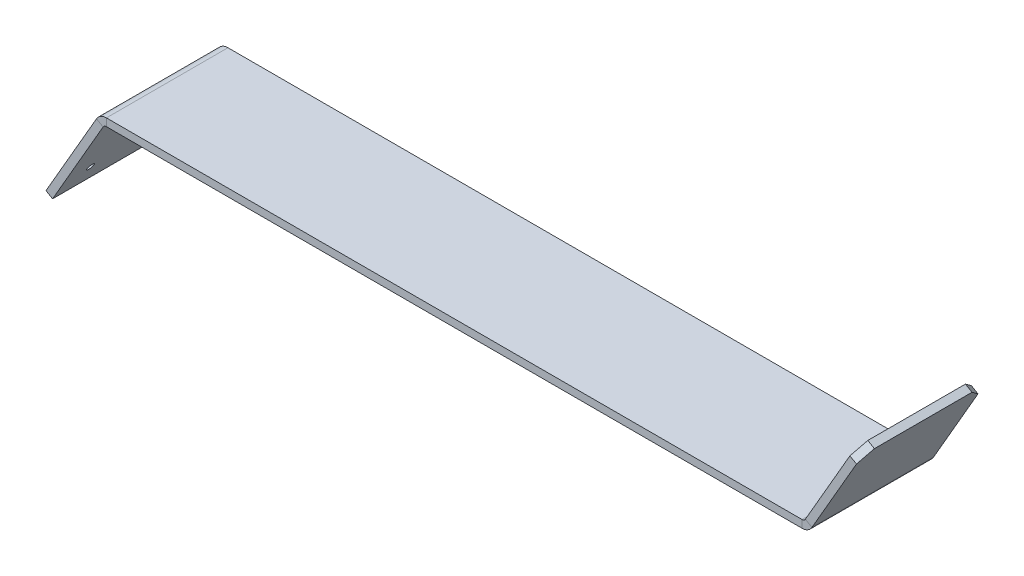
ISO-10303-21;
HEADER;
FILE_DESCRIPTION(('STEP AP214'),'2;1');
FILE_NAME('part.step','',(''),(''),'','','');
FILE_SCHEMA(('AUTOMOTIVE_DESIGN { 1 0 10303 214 1 1 1 1 }'));
ENDSEC;
DATA;
#1=APPLICATION_CONTEXT('core data for automotive mechanical design processes');
#2=APPLICATION_PROTOCOL_DEFINITION('international standard','automotive_design',2000,#1);
#3=PRODUCT_CONTEXT('',#1,'mechanical');
#4=PRODUCT('Part','Part','',(#3));
#5=PRODUCT_RELATED_PRODUCT_CATEGORY('part','',(#4));
#6=PRODUCT_DEFINITION_FORMATION('','',#4);
#7=PRODUCT_DEFINITION_CONTEXT('part definition',#1,'design');
#8=PRODUCT_DEFINITION('design','',#6,#7);
#9=PRODUCT_DEFINITION_SHAPE('','',#8);
#10=(LENGTH_UNIT() NAMED_UNIT(*) SI_UNIT(.MILLI.,.METRE.));
#11=(NAMED_UNIT(*) PLANE_ANGLE_UNIT() SI_UNIT($,.RADIAN.));
#12=(NAMED_UNIT(*) SI_UNIT($,.STERADIAN.) SOLID_ANGLE_UNIT());
#13=UNCERTAINTY_MEASURE_WITH_UNIT(LENGTH_MEASURE(1.E-05),#10,'distance_accuracy_value','');
#14=(GEOMETRIC_REPRESENTATION_CONTEXT(3) GLOBAL_UNCERTAINTY_ASSIGNED_CONTEXT((#13)) GLOBAL_UNIT_ASSIGNED_CONTEXT((#10,
#11,#12)) REPRESENTATION_CONTEXT('',''));
#15=CARTESIAN_POINT('',(0.,0.,0.));
#16=DIRECTION('',(0.,0.,1.));
#17=DIRECTION('',(1.,0.,0.));
#18=AXIS2_PLACEMENT_3D('',#15,#16,#17);
#19=CARTESIAN_POINT('',(-12.9100653599426,-31.9008891324553,-10.8));
#20=DIRECTION('',(-0.866025403784436,0.500000000000004,0.));
#21=DIRECTION('',(-0.500000000000004,-0.866025403784436,0.));
#22=AXIS2_PLACEMENT_3D('',#19,#20,#21);
#23=CYLINDRICAL_SURFACE('',#22,1.5);
#24=CARTESIAN_POINT('',(-12.9100653599426,-31.9008891324553,-10.8));
#25=DIRECTION('',(-0.866025403784436,0.500000000000004,0.));
#26=DIRECTION('',(-0.500000000000004,-0.866025403784436,0.));
#27=AXIS2_PLACEMENT_3D('',#24,#25,#26);
#28=CIRCLE('',#27,1.5);
#29=CARTESIAN_POINT('',(-13.6600653599426,-33.1999272381319,-10.8));
#30=VERTEX_POINT('',#29);
#31=EDGE_CURVE('E90',#30,#30,#28,.T.);
#32=ORIENTED_EDGE('',*,*,#31,.F.);
#33=EDGE_LOOP('',(#32));
#34=FACE_BOUND('',#33,.T.);
#35=CARTESIAN_POINT('',(-15.6640261439771,-30.3108891324553,-10.8));
#36=DIRECTION('',(-0.866025403784436,0.500000000000004,0.));
#37=DIRECTION('',(-0.500000000000004,-0.866025403784436,0.));
#38=AXIS2_PLACEMENT_3D('',#35,#36,#37);
#39=CIRCLE('',#38,1.5);
#40=CARTESIAN_POINT('',(-16.4140261439771,-31.6099272381319,-10.8));
#41=VERTEX_POINT('',#40);
#42=EDGE_CURVE('E13',#41,#41,#39,.T.);
#43=ORIENTED_EDGE('',*,*,#42,.T.);
#44=EDGE_LOOP('',(#43));
#45=FACE_BOUND('',#44,.T.);
#46=ADVANCED_FACE('F83',(#34,#45),#23,.F.);
#47=CARTESIAN_POINT('',(-0.410065359942499,-10.2502540378444,-10.8));
#48=DIRECTION('',(-0.866025403784436,0.500000000000004,0.));
#49=DIRECTION('',(-0.500000000000004,-0.866025403784436,0.));
#50=AXIS2_PLACEMENT_3D('',#47,#48,#49);
#51=CYLINDRICAL_SURFACE('',#50,1.5);
#52=CARTESIAN_POINT('',(-0.410065359942499,-10.2502540378444,-10.8));
#53=DIRECTION('',(-0.866025403784436,0.500000000000004,0.));
#54=DIRECTION('',(-0.500000000000004,-0.866025403784436,0.));
#55=AXIS2_PLACEMENT_3D('',#52,#53,#54);
#56=CIRCLE('',#55,1.5);
#57=CARTESIAN_POINT('',(-1.16006535994251,-11.549292143521,-10.8));
#58=VERTEX_POINT('',#57);
#59=EDGE_CURVE('E324',#58,#58,#56,.T.);
#60=ORIENTED_EDGE('',*,*,#59,.F.);
#61=EDGE_LOOP('',(#60));
#62=FACE_BOUND('',#61,.T.);
#63=CARTESIAN_POINT('',(-3.16402614397701,-8.66025403784436,-10.8));
#64=DIRECTION('',(-0.866025403784436,0.500000000000004,0.));
#65=DIRECTION('',(-0.500000000000004,-0.866025403784436,0.));
#66=AXIS2_PLACEMENT_3D('',#63,#64,#65);
#67=CIRCLE('',#66,1.5);
#68=CARTESIAN_POINT('',(-3.91402614397701,-9.95929214352102,-10.8));
#69=VERTEX_POINT('',#68);
#70=EDGE_CURVE('E327',#69,#69,#67,.T.);
#71=ORIENTED_EDGE('',*,*,#70,.T.);
#72=EDGE_LOOP('',(#71));
#73=FACE_BOUND('',#72,.T.);
#74=ADVANCED_FACE('F336',(#62,#73),#51,.F.);
#75=CARTESIAN_POINT('',(0.,-3.18,-50.8));
#76=DIRECTION('',(0.,0.,1.));
#77=DIRECTION('',(1.,0.,0.));
#78=AXIS2_PLACEMENT_3D('',#75,#76,#77);
#79=PLANE('',#78);
#80=DIRECTION('',(0.,1.,0.));
#81=VECTOR('',#80,1.);
#82=CARTESIAN_POINT('',(4.59570814274943,-3.18,-50.8));
#83=LINE('',#82,#81);
#84=CARTESIAN_POINT('',(4.59570814274943,-3.18,-50.8));
#85=VERTEX_POINT('',#84);
#86=CARTESIAN_POINT('',(4.59570814274943,0.,-50.8));
#87=VERTEX_POINT('',#86);
#88=EDGE_CURVE('E235',#85,#87,#83,.T.);
#89=ORIENTED_EDGE('',*,*,#88,.T.);
#90=DIRECTION('',(1.,0.,0.));
#91=VECTOR('',#90,1.);
#92=CARTESIAN_POINT('',(0.,0.,-50.8));
#93=LINE('',#92,#91);
#94=CARTESIAN_POINT('',(295.404291857251,0.,-50.8));
#95=VERTEX_POINT('',#94);
#96=EDGE_CURVE('E298',#87,#95,#93,.T.);
#97=ORIENTED_EDGE('',*,*,#96,.T.);
#98=DIRECTION('',(0.,-1.,0.));
#99=VECTOR('',#98,1.);
#100=CARTESIAN_POINT('',(295.404291857251,0.,-50.8));
#101=LINE('',#100,#99);
#102=CARTESIAN_POINT('',(295.404291857251,-3.17999999999998,-50.8));
#103=VERTEX_POINT('',#102);
#104=EDGE_CURVE('E284',#95,#103,#101,.T.);
#105=ORIENTED_EDGE('',*,*,#104,.T.);
#106=DIRECTION('',(1.,0.,0.));
#107=VECTOR('',#106,1.);
#108=CARTESIAN_POINT('',(0.,-3.18,-50.8));
#109=LINE('',#108,#107);
#110=EDGE_CURVE('E301',#85,#103,#109,.T.);
#111=ORIENTED_EDGE('',*,*,#110,.F.);
#112=EDGE_LOOP('',(#89,#97,#105,#111));
#113=FACE_BOUND('',#112,.T.);
#114=ADVANCED_FACE('F417',(#113),#79,.F.);
#115=CARTESIAN_POINT('',(0.,-3.18,0.));
#116=DIRECTION('',(0.,1.,0.));
#117=DIRECTION('',(0.,0.,1.));
#118=AXIS2_PLACEMENT_3D('',#115,#116,#117);
#119=PLANE('',#118);
#120=DIRECTION('',(0.,0.,-1.));
#121=VECTOR('',#120,1.);
#122=CARTESIAN_POINT('',(4.59570814274943,-3.18,-50.8));
#123=LINE('',#122,#121);
#124=CARTESIAN_POINT('',(4.59570814274943,-3.18,0.));
#125=VERTEX_POINT('',#124);
#126=EDGE_CURVE('E241',#85,#125,#123,.F.);
#127=ORIENTED_EDGE('',*,*,#126,.F.);
#128=ORIENTED_EDGE('',*,*,#110,.T.);
#129=DIRECTION('',(0.,0.,-1.));
#130=VECTOR('',#129,1.);
#131=CARTESIAN_POINT('',(295.404291857251,-3.17999999999998,-50.8));
#132=LINE('',#131,#130);
#133=CARTESIAN_POINT('',(295.404291857251,-3.18,0.));
#134=VERTEX_POINT('',#133);
#135=EDGE_CURVE('E277',#103,#134,#132,.F.);
#136=ORIENTED_EDGE('',*,*,#135,.T.);
#137=DIRECTION('',(1.,0.,0.));
#138=VECTOR('',#137,1.);
#139=CARTESIAN_POINT('',(0.,-3.18,0.));
#140=LINE('',#139,#138);
#141=EDGE_CURVE('E303',#125,#134,#140,.T.);
#142=ORIENTED_EDGE('',*,*,#141,.F.);
#143=EDGE_LOOP('',(#127,#128,#136,#142));
#144=FACE_BOUND('',#143,.T.);
#145=ADVANCED_FACE('F413',(#144),#119,.F.);
#146=CARTESIAN_POINT('',(0.,0.,0.));
#147=DIRECTION('',(0.,1.,0.));
#148=DIRECTION('',(0.,0.,1.));
#149=AXIS2_PLACEMENT_3D('',#146,#147,#148);
#150=PLANE('',#149);
#151=ORIENTED_EDGE('',*,*,#96,.F.);
#152=DIRECTION('',(0.,0.,-1.));
#153=VECTOR('',#152,1.);
#154=CARTESIAN_POINT('',(4.59570814274943,0.,-50.8));
#155=LINE('',#154,#153);
#156=CARTESIAN_POINT('',(4.59570814274943,0.,0.));
#157=VERTEX_POINT('',#156);
#158=EDGE_CURVE('E228',#87,#157,#155,.F.);
#159=ORIENTED_EDGE('',*,*,#158,.T.);
#160=DIRECTION('',(1.,0.,0.));
#161=VECTOR('',#160,1.);
#162=CARTESIAN_POINT('',(0.,0.,0.));
#163=LINE('',#162,#161);
#164=CARTESIAN_POINT('',(295.404291857251,0.,0.));
#165=VERTEX_POINT('',#164);
#166=EDGE_CURVE('E304',#157,#165,#163,.T.);
#167=ORIENTED_EDGE('',*,*,#166,.T.);
#168=DIRECTION('',(0.,0.,-1.));
#169=VECTOR('',#168,1.);
#170=CARTESIAN_POINT('',(295.404291857251,0.,-50.8));
#171=LINE('',#170,#169);
#172=EDGE_CURVE('E290',#95,#165,#171,.F.);
#173=ORIENTED_EDGE('',*,*,#172,.F.);
#174=EDGE_LOOP('',(#151,#159,#167,#173));
#175=FACE_BOUND('',#174,.T.);
#176=ADVANCED_FACE('F416',(#175),#150,.T.);
#177=CARTESIAN_POINT('',(0.,-3.18,0.));
#178=DIRECTION('',(0.,0.,1.));
#179=DIRECTION('',(1.,0.,0.));
#180=AXIS2_PLACEMENT_3D('',#177,#178,#179);
#181=PLANE('',#180);
#182=DIRECTION('',(0.,1.,0.));
#183=VECTOR('',#182,1.);
#184=CARTESIAN_POINT('',(4.59570814274943,-3.18,0.));
#185=LINE('',#184,#183);
#186=EDGE_CURVE('E246',#125,#157,#185,.T.);
#187=ORIENTED_EDGE('',*,*,#186,.F.);
#188=ORIENTED_EDGE('',*,*,#141,.T.);
#189=DIRECTION('',(0.,-1.,0.));
#190=VECTOR('',#189,1.);
#191=CARTESIAN_POINT('',(295.404291857251,0.,0.));
#192=LINE('',#191,#190);
#193=EDGE_CURVE('E295',#165,#134,#192,.T.);
#194=ORIENTED_EDGE('',*,*,#193,.F.);
#195=ORIENTED_EDGE('',*,*,#166,.F.);
#196=EDGE_LOOP('',(#187,#188,#194,#195));
#197=FACE_BOUND('',#196,.T.);
#198=ADVANCED_FACE('F408',(#197),#181,.T.);
#199=CARTESIAN_POINT('',(295.404291857251,1.60000000000003,0.));
#200=DIRECTION('',(0.,0.,1.));
#201=DIRECTION('',(0.,-1.,0.));
#202=AXIS2_PLACEMENT_3D('',#199,#200,#201);
#203=PLANE('',#202);
#204=DIRECTION('',(-0.866025403784437,0.500000000000004,0.));
#205=VECTOR('',#204,1.);
#206=CARTESIAN_POINT('',(299.54389328734,-0.789999999999968,0.));
#207=LINE('',#206,#205);
#208=CARTESIAN_POINT('',(296.789932503306,0.800000000000016,0.));
#209=VERTEX_POINT('',#208);
#210=CARTESIAN_POINT('',(299.54389328734,-0.789999999999987,0.));
#211=VERTEX_POINT('',#210);
#212=EDGE_CURVE('E249',#209,#211,#207,.F.);
#213=ORIENTED_EDGE('',*,*,#212,.F.);
#214=CARTESIAN_POINT('',(295.404291857251,1.60000000000003,0.));
#215=DIRECTION('',(0.,0.,-1.));
#216=DIRECTION('',(0.,1.,0.));
#217=AXIS2_PLACEMENT_3D('',#214,#215,#216);
#218=CIRCLE('',#217,1.60000000000002);
#219=EDGE_CURVE('E287',#165,#209,#218,.F.);
#220=ORIENTED_EDGE('',*,*,#219,.F.);
#221=ORIENTED_EDGE('',*,*,#193,.T.);
#222=CARTESIAN_POINT('',(295.404291857251,1.60000000000003,0.));
#223=DIRECTION('',(0.,0.,-1.));
#224=DIRECTION('',(0.,1.,0.));
#225=AXIS2_PLACEMENT_3D('',#222,#223,#224);
#226=CIRCLE('',#225,4.78000000000002);
#227=EDGE_CURVE('E280',#134,#211,#226,.F.);
#228=ORIENTED_EDGE('',*,*,#227,.T.);
#229=EDGE_LOOP('',(#213,#220,#221,#228));
#230=FACE_BOUND('',#229,.T.);
#231=ADVANCED_FACE('F405',(#230),#203,.T.);
#232=CARTESIAN_POINT('',(295.404291857251,1.60000000000003,-50.8));
#233=DIRECTION('',(0.,0.,1.));
#234=DIRECTION('',(0.,-1.,0.));
#235=AXIS2_PLACEMENT_3D('',#232,#233,#234);
#236=PLANE('',#235);
#237=CARTESIAN_POINT('',(295.404291857251,1.60000000000003,-50.8));
#238=DIRECTION('',(0.,0.,-1.));
#239=DIRECTION('',(0.,1.,0.));
#240=AXIS2_PLACEMENT_3D('',#237,#238,#239);
#241=CIRCLE('',#240,1.60000000000002);
#242=CARTESIAN_POINT('',(296.789932503306,0.80000000000002,-50.8));
#243=VERTEX_POINT('',#242);
#244=EDGE_CURVE('E254',#243,#95,#241,.T.);
#245=ORIENTED_EDGE('',*,*,#244,.F.);
#246=DIRECTION('',(-0.866025403784437,0.500000000000004,0.));
#247=VECTOR('',#246,1.);
#248=CARTESIAN_POINT('',(296.789932503306,0.800000000000078,-50.8));
#249=LINE('',#248,#247);
#250=CARTESIAN_POINT('',(299.54389328734,-0.790000000000018,-50.8));
#251=VERTEX_POINT('',#250);
#252=EDGE_CURVE('E270',#243,#251,#249,.F.);
#253=ORIENTED_EDGE('',*,*,#252,.T.);
#254=CARTESIAN_POINT('',(295.404291857251,1.60000000000003,-50.8));
#255=DIRECTION('',(0.,0.,-1.));
#256=DIRECTION('',(0.,1.,0.));
#257=AXIS2_PLACEMENT_3D('',#254,#255,#256);
#258=CIRCLE('',#257,4.78000000000002);
#259=EDGE_CURVE('E281',#251,#103,#258,.T.);
#260=ORIENTED_EDGE('',*,*,#259,.T.);
#261=ORIENTED_EDGE('',*,*,#104,.F.);
#262=EDGE_LOOP('',(#245,#253,#260,#261));
#263=FACE_BOUND('',#262,.T.);
#264=ADVANCED_FACE('F400',(#263),#236,.F.);
#265=CARTESIAN_POINT('',(295.404291857251,1.60000000000003,-50.8));
#266=DIRECTION('',(0.,0.,-1.));
#267=DIRECTION('',(0.866025403784436,-0.500000000000004,0.));
#268=AXIS2_PLACEMENT_3D('',#265,#266,#267);
#269=CYLINDRICAL_SURFACE('',#268,4.78000000000002);
#270=ORIENTED_EDGE('',*,*,#135,.F.);
#271=ORIENTED_EDGE('',*,*,#259,.F.);
#272=DIRECTION('',(0.,0.,-1.));
#273=VECTOR('',#272,1.);
#274=CARTESIAN_POINT('',(299.54389328734,-0.790000000000017,0.));
#275=LINE('',#274,#273);
#276=EDGE_CURVE('E267',#251,#211,#275,.F.);
#277=ORIENTED_EDGE('',*,*,#276,.T.);
#278=ORIENTED_EDGE('',*,*,#227,.F.);
#279=EDGE_LOOP('',(#270,#271,#277,#278));
#280=FACE_BOUND('',#279,.T.);
#281=ADVANCED_FACE('F397',(#280),#269,.T.);
#282=CARTESIAN_POINT('',(295.404291857251,1.60000000000003,-50.8));
#283=DIRECTION('',(0.,0.,-1.));
#284=DIRECTION('',(0.866025403784436,-0.500000000000004,0.));
#285=AXIS2_PLACEMENT_3D('',#282,#283,#284);
#286=CYLINDRICAL_SURFACE('',#285,1.60000000000002);
#287=ORIENTED_EDGE('',*,*,#172,.T.);
#288=ORIENTED_EDGE('',*,*,#219,.T.);
#289=DIRECTION('',(0.,0.,-1.));
#290=VECTOR('',#289,1.);
#291=CARTESIAN_POINT('',(296.789932503306,0.800000000000078,0.));
#292=LINE('',#291,#290);
#293=EDGE_CURVE('E273',#209,#243,#292,.T.);
#294=ORIENTED_EDGE('',*,*,#293,.T.);
#295=ORIENTED_EDGE('',*,*,#244,.T.);
#296=EDGE_LOOP('',(#287,#288,#294,#295));
#297=FACE_BOUND('',#296,.T.);
#298=ADVANCED_FACE('F395',(#297),#286,.F.);
#299=CARTESIAN_POINT('',(299.082013071988,-1.58999999999999,0.));
#300=DIRECTION('',(0.,0.,-1.));
#301=DIRECTION('',(-1.,0.,0.));
#302=AXIS2_PLACEMENT_3D('',#299,#300,#301);
#303=PLANE('',#302);
#304=DIRECTION('',(-0.500000000000004,-0.866025403784436,0.));
#305=VECTOR('',#304,1.);
#306=CARTESIAN_POINT('',(224.082013071987,-131.493810567666,0.));
#307=LINE('',#306,#305);
#308=CARTESIAN_POINT('',(318.164026143977,31.4610161513774,0.));
#309=VERTEX_POINT('',#308);
#310=EDGE_CURVE('E258',#309,#211,#307,.T.);
#311=ORIENTED_EDGE('',*,*,#310,.F.);
#312=DIRECTION('',(-0.866025403784436,0.500000000000004,0.));
#313=VECTOR('',#312,1.);
#314=CARTESIAN_POINT('',(318.164026143977,31.4610161513774,0.));
#315=LINE('',#314,#313);
#316=CARTESIAN_POINT('',(315.410065359943,33.0510161513774,0.));
#317=VERTEX_POINT('',#316);
#318=EDGE_CURVE('E317',#309,#317,#315,.T.);
#319=ORIENTED_EDGE('',*,*,#318,.T.);
#320=DIRECTION('',(0.500000000000004,0.866025403784436,0.));
#321=VECTOR('',#320,1.);
#322=CARTESIAN_POINT('',(296.328052287954,0.,0.));
#323=LINE('',#322,#321);
#324=EDGE_CURVE('E265',#317,#209,#323,.F.);
#325=ORIENTED_EDGE('',*,*,#324,.T.);
#326=ORIENTED_EDGE('',*,*,#212,.T.);
#327=EDGE_LOOP('',(#311,#319,#325,#326));
#328=FACE_BOUND('',#327,.T.);
#329=ADVANCED_FACE('F391',(#328),#303,.F.);
#330=CARTESIAN_POINT('',(320.664026143977,35.7911431702997,-50.8));
#331=DIRECTION('',(0.,0.,1.));
#332=DIRECTION('',(0.,-1.,0.));
#333=AXIS2_PLACEMENT_3D('',#330,#331,#332);
#334=PLANE('',#333);
#335=DIRECTION('',(-0.500000000000004,-0.866025403784436,0.));
#336=VECTOR('',#335,1.);
#337=CARTESIAN_POINT('',(317.910065359943,37.3811431702996,-50.8));
#338=LINE('',#337,#336);
#339=CARTESIAN_POINT('',(315.410065359943,33.0510161513774,-50.8));
#340=VERTEX_POINT('',#339);
#341=EDGE_CURVE('E262',#243,#340,#338,.F.);
#342=ORIENTED_EDGE('',*,*,#341,.T.);
#343=DIRECTION('',(0.866025403784436,-0.500000000000004,0.));
#344=VECTOR('',#343,1.);
#345=CARTESIAN_POINT('',(318.164026143977,31.4610161513774,-50.8));
#346=LINE('',#345,#344);
#347=CARTESIAN_POINT('',(318.164026143977,31.4610161513774,-50.8));
#348=VERTEX_POINT('',#347);
#349=EDGE_CURVE('E313',#340,#348,#346,.T.);
#350=ORIENTED_EDGE('',*,*,#349,.T.);
#351=DIRECTION('',(0.500000000000004,0.866025403784436,0.));
#352=VECTOR('',#351,1.);
#353=CARTESIAN_POINT('',(224.082013071987,-131.493810567666,-50.8));
#354=LINE('',#353,#352);
#355=EDGE_CURVE('E255',#251,#348,#354,.T.);
#356=ORIENTED_EDGE('',*,*,#355,.F.);
#357=ORIENTED_EDGE('',*,*,#252,.F.);
#358=EDGE_LOOP('',(#342,#350,#356,#357));
#359=FACE_BOUND('',#358,.T.);
#360=ADVANCED_FACE('F383',(#359),#334,.F.);
#361=CARTESIAN_POINT('',(224.082013071987,-131.493810567666,0.));
#362=DIRECTION('',(-0.866025403784437,0.500000000000004,0.));
#363=DIRECTION('',(-0.500000000000004,-0.866025403784436,0.));
#364=AXIS2_PLACEMENT_3D('',#361,#362,#363);
#365=PLANE('',#364);
#366=DIRECTION('',(0.,0.,1.));
#367=VECTOR('',#366,1.);
#368=CARTESIAN_POINT('',(320.664026143977,35.7911431702996,0.));
#369=LINE('',#368,#367);
#370=CARTESIAN_POINT('',(320.664026143977,35.7911431702996,-45.8));
#371=VERTEX_POINT('',#370);
#372=CARTESIAN_POINT('',(320.664026143977,35.7911431702996,-5.00000000000004));
#373=VERTEX_POINT('',#372);
#374=EDGE_CURVE('E252',#371,#373,#369,.T.);
#375=ORIENTED_EDGE('',*,*,#374,.T.);
#376=DIRECTION('',(0.353553390593276,0.612372435695793,-0.707106781186548));
#377=VECTOR('',#376,1.);
#378=CARTESIAN_POINT('',(318.164026143977,31.4610161513774,0.));
#379=LINE('',#378,#377);
#380=EDGE_CURVE('E322',#373,#309,#379,.F.);
#381=ORIENTED_EDGE('',*,*,#380,.T.);
#382=ORIENTED_EDGE('',*,*,#310,.T.);
#383=ORIENTED_EDGE('',*,*,#276,.F.);
#384=ORIENTED_EDGE('',*,*,#355,.T.);
#385=DIRECTION('',(-0.353553390593277,-0.612372435695795,-0.707106781186546));
#386=VECTOR('',#385,1.);
#387=CARTESIAN_POINT('',(320.664026143977,35.7911431702997,-45.8));
#388=LINE('',#387,#386);
#389=EDGE_CURVE('E315',#348,#371,#388,.F.);
#390=ORIENTED_EDGE('',*,*,#389,.T.);
#391=EDGE_LOOP('',(#375,#381,#382,#383,#384,#390));
#392=FACE_BOUND('',#391,.T.);
#393=ADVANCED_FACE('F379',(#392),#365,.F.);
#394=CARTESIAN_POINT('',(221.328052287953,-129.903810567666,0.));
#395=DIRECTION('',(-0.866025403784437,0.500000000000004,0.));
#396=DIRECTION('',(-0.500000000000004,-0.866025403784436,0.));
#397=AXIS2_PLACEMENT_3D('',#394,#395,#396);
#398=PLANE('',#397);
#399=ORIENTED_EDGE('',*,*,#324,.F.);
#400=DIRECTION('',(-0.353553390593276,-0.612372435695793,0.707106781186548));
#401=VECTOR('',#400,1.);
#402=CARTESIAN_POINT('',(268.369058823948,-48.4263972081444,94.082013071989));
#403=LINE('',#402,#401);
#404=CARTESIAN_POINT('',(317.910065359943,37.3811431702996,-5.00000000000004));
#405=VERTEX_POINT('',#404);
#406=EDGE_CURVE('E105',#317,#405,#403,.F.);
#407=ORIENTED_EDGE('',*,*,#406,.T.);
#408=DIRECTION('',(0.,0.,-1.));
#409=VECTOR('',#408,1.);
#410=CARTESIAN_POINT('',(317.910065359943,37.3811431702996,0.));
#411=LINE('',#410,#409);
#412=CARTESIAN_POINT('',(317.910065359943,37.3811431702996,-45.8));
#413=VERTEX_POINT('',#412);
#414=EDGE_CURVE('E260',#413,#405,#411,.F.);
#415=ORIENTED_EDGE('',*,*,#414,.F.);
#416=DIRECTION('',(0.353553390593277,0.612372435695795,0.707106781186546));
#417=VECTOR('',#416,1.);
#418=CARTESIAN_POINT('',(281.069058823948,-26.4293519520202,-119.482013071989));
#419=LINE('',#418,#417);
#420=EDGE_CURVE('E311',#413,#340,#419,.F.);
#421=ORIENTED_EDGE('',*,*,#420,.T.);
#422=ORIENTED_EDGE('',*,*,#341,.F.);
#423=ORIENTED_EDGE('',*,*,#293,.F.);
#424=EDGE_LOOP('',(#399,#407,#415,#421,#422,#423));
#425=FACE_BOUND('',#424,.T.);
#426=ADVANCED_FACE('F382',(#425),#398,.T.);
#427=CARTESIAN_POINT('',(320.664026143977,35.7911431702997,0.));
#428=DIRECTION('',(-0.500000000000004,-0.866025403784436,0.));
#429=DIRECTION('',(0.866025403784436,-0.500000000000004,0.));
#430=AXIS2_PLACEMENT_3D('',#427,#428,#429);
#431=PLANE('',#430);
#432=ORIENTED_EDGE('',*,*,#414,.T.);
#433=DIRECTION('',(0.866025403784436,-0.500000000000004,0.));
#434=VECTOR('',#433,1.);
#435=CARTESIAN_POINT('',(320.664026143977,35.7911431702997,-5.00000000000004));
#436=LINE('',#435,#434);
#437=EDGE_CURVE('E97',#405,#373,#436,.T.);
#438=ORIENTED_EDGE('',*,*,#437,.T.);
#439=ORIENTED_EDGE('',*,*,#374,.F.);
#440=DIRECTION('',(-0.866025403784436,0.500000000000004,0.));
#441=VECTOR('',#440,1.);
#442=CARTESIAN_POINT('',(320.664026143977,35.7911431702997,-45.8));
#443=LINE('',#442,#441);
#444=EDGE_CURVE('E306',#371,#413,#443,.T.);
#445=ORIENTED_EDGE('',*,*,#444,.T.);
#446=EDGE_LOOP('',(#432,#438,#439,#445));
#447=FACE_BOUND('',#446,.T.);
#448=ADVANCED_FACE('F374',(#447),#431,.F.);
#449=CARTESIAN_POINT('',(4.59570814274943,-4.78,0.));
#450=DIRECTION('',(0.,0.,1.));
#451=DIRECTION('',(1.,0.,0.));
#452=AXIS2_PLACEMENT_3D('',#449,#450,#451);
#453=PLANE('',#452);
#454=DIRECTION('',(0.866025403784436,-0.500000000000004,0.));
#455=VECTOR('',#454,1.);
#456=CARTESIAN_POINT('',(0.45610671265982,-2.38999999999998,0.));
#457=LINE('',#456,#455);
#458=CARTESIAN_POINT('',(3.21006749669433,-3.97999999999999,0.));
#459=VERTEX_POINT('',#458);
#460=CARTESIAN_POINT('',(0.456106712659822,-2.38999999999998,0.));
#461=VERTEX_POINT('',#460);
#462=EDGE_CURVE('E210',#459,#461,#457,.F.);
#463=ORIENTED_EDGE('',*,*,#462,.F.);
#464=CARTESIAN_POINT('',(4.59570814274943,-4.78,0.));
#465=DIRECTION('',(0.,0.,-1.));
#466=DIRECTION('',(-1.,0.,0.));
#467=AXIS2_PLACEMENT_3D('',#464,#465,#466);
#468=CIRCLE('',#467,1.6);
#469=EDGE_CURVE('E238',#125,#459,#468,.F.);
#470=ORIENTED_EDGE('',*,*,#469,.F.);
#471=ORIENTED_EDGE('',*,*,#186,.T.);
#472=CARTESIAN_POINT('',(4.59570814274943,-4.78,0.));
#473=DIRECTION('',(0.,0.,-1.));
#474=DIRECTION('',(-1.,0.,0.));
#475=AXIS2_PLACEMENT_3D('',#472,#473,#474);
#476=CIRCLE('',#475,4.78);
#477=EDGE_CURVE('E231',#157,#461,#476,.F.);
#478=ORIENTED_EDGE('',*,*,#477,.T.);
#479=EDGE_LOOP('',(#463,#470,#471,#478));
#480=FACE_BOUND('',#479,.T.);
#481=ADVANCED_FACE('F371',(#480),#453,.T.);
#482=CARTESIAN_POINT('',(4.59570814274943,-4.78,-50.8));
#483=DIRECTION('',(0.,0.,1.));
#484=DIRECTION('',(1.,0.,0.));
#485=AXIS2_PLACEMENT_3D('',#482,#483,#484);
#486=PLANE('',#485);
#487=CARTESIAN_POINT('',(4.59570814274943,-4.78,-50.8));
#488=DIRECTION('',(0.,0.,-1.));
#489=DIRECTION('',(-1.,0.,0.));
#490=AXIS2_PLACEMENT_3D('',#487,#488,#489);
#491=CIRCLE('',#490,1.6);
#492=CARTESIAN_POINT('',(3.21006749669433,-3.97999999999999,-50.8));
#493=VERTEX_POINT('',#492);
#494=EDGE_CURVE('E243',#493,#85,#491,.T.);
#495=ORIENTED_EDGE('',*,*,#494,.F.);
#496=DIRECTION('',(0.866025403784436,-0.500000000000004,0.));
#497=VECTOR('',#496,1.);
#498=CARTESIAN_POINT('',(3.21006749669433,-3.97999999999999,-50.8));
#499=LINE('',#498,#497);
#500=CARTESIAN_POINT('',(0.456106712659823,-2.38999999999998,-50.8));
#501=VERTEX_POINT('',#500);
#502=EDGE_CURVE('E221',#493,#501,#499,.F.);
#503=ORIENTED_EDGE('',*,*,#502,.T.);
#504=CARTESIAN_POINT('',(4.59570814274943,-4.78,-50.8));
#505=DIRECTION('',(0.,0.,-1.));
#506=DIRECTION('',(-1.,0.,0.));
#507=AXIS2_PLACEMENT_3D('',#504,#505,#506);
#508=CIRCLE('',#507,4.78);
#509=EDGE_CURVE('E232',#501,#87,#508,.T.);
#510=ORIENTED_EDGE('',*,*,#509,.T.);
#511=ORIENTED_EDGE('',*,*,#88,.F.);
#512=EDGE_LOOP('',(#495,#503,#510,#511));
#513=FACE_BOUND('',#512,.T.);
#514=ADVANCED_FACE('F366',(#513),#486,.F.);
#515=CARTESIAN_POINT('',(4.59570814274943,-4.78,-50.8));
#516=DIRECTION('',(0.,0.,-1.));
#517=DIRECTION('',(-0.866025403784436,0.500000000000004,0.));
#518=AXIS2_PLACEMENT_3D('',#515,#516,#517);
#519=CYLINDRICAL_SURFACE('',#518,4.78);
#520=ORIENTED_EDGE('',*,*,#158,.F.);
#521=ORIENTED_EDGE('',*,*,#509,.F.);
#522=DIRECTION('',(0.,0.,-1.));
#523=VECTOR('',#522,1.);
#524=CARTESIAN_POINT('',(0.456106712659823,-2.38999999999998,0.));
#525=LINE('',#524,#523);
#526=EDGE_CURVE('E219',#501,#461,#525,.F.);
#527=ORIENTED_EDGE('',*,*,#526,.T.);
#528=ORIENTED_EDGE('',*,*,#477,.F.);
#529=EDGE_LOOP('',(#520,#521,#527,#528));
#530=FACE_BOUND('',#529,.T.);
#531=ADVANCED_FACE('F363',(#530),#519,.T.);
#532=CARTESIAN_POINT('',(4.59570814274943,-4.78,-50.8));
#533=DIRECTION('',(0.,0.,-1.));
#534=DIRECTION('',(-0.866025403784436,0.500000000000004,0.));
#535=AXIS2_PLACEMENT_3D('',#532,#533,#534);
#536=CYLINDRICAL_SURFACE('',#535,1.6);
#537=ORIENTED_EDGE('',*,*,#126,.T.);
#538=ORIENTED_EDGE('',*,*,#469,.T.);
#539=DIRECTION('',(0.,0.,-1.));
#540=VECTOR('',#539,1.);
#541=CARTESIAN_POINT('',(3.21006749669433,-3.97999999999999,0.));
#542=LINE('',#541,#540);
#543=EDGE_CURVE('E224',#459,#493,#542,.T.);
#544=ORIENTED_EDGE('',*,*,#543,.T.);
#545=ORIENTED_EDGE('',*,*,#494,.T.);
#546=EDGE_LOOP('',(#537,#538,#544,#545));
#547=FACE_BOUND('',#546,.T.);
#548=ADVANCED_FACE('F362',(#547),#536,.F.);
#549=CARTESIAN_POINT('',(0.917986928011522,-1.58999999999999,0.));
#550=DIRECTION('',(0.,0.,-1.));
#551=DIRECTION('',(-1.,0.,0.));
#552=AXIS2_PLACEMENT_3D('',#549,#550,#551);
#553=PLANE('',#552);
#554=ORIENTED_EDGE('',*,*,#462,.T.);
#555=DIRECTION('',(0.500000000000004,0.866025403784436,0.));
#556=VECTOR('',#555,1.);
#557=CARTESIAN_POINT('',(2.29496732002879,0.794999999999999,0.));
#558=LINE('',#557,#556);
#559=CARTESIAN_POINT('',(-20.6640261439771,-38.9711431702996,0.));
#560=VERTEX_POINT('',#559);
#561=EDGE_CURVE('E191',#560,#461,#558,.T.);
#562=ORIENTED_EDGE('',*,*,#561,.F.);
#563=DIRECTION('',(0.866025403784436,-0.500000000000004,0.));
#564=VECTOR('',#563,1.);
#565=CARTESIAN_POINT('',(-20.6640261439771,-38.9711431702996,0.));
#566=LINE('',#565,#564);
#567=CARTESIAN_POINT('',(-17.9100653599426,-40.5611431702996,0.));
#568=VERTEX_POINT('',#567);
#569=EDGE_CURVE('E197',#560,#568,#566,.T.);
#570=ORIENTED_EDGE('',*,*,#569,.T.);
#571=DIRECTION('',(-0.500000000000004,-0.866025403784436,0.));
#572=VECTOR('',#571,1.);
#573=CARTESIAN_POINT('',(3.67194771204603,-3.18,0.));
#574=LINE('',#573,#572);
#575=EDGE_CURVE('E217',#568,#459,#574,.F.);
#576=ORIENTED_EDGE('',*,*,#575,.T.);
#577=EDGE_LOOP('',(#554,#562,#570,#576));
#578=FACE_BOUND('',#577,.T.);
#579=ADVANCED_FACE('F209',(#578),#553,.F.);
#580=CARTESIAN_POINT('',(-20.6640261439771,-38.9711431702996,-50.8));
#581=DIRECTION('',(0.,0.,1.));
#582=DIRECTION('',(0.,-1.,0.));
#583=AXIS2_PLACEMENT_3D('',#580,#581,#582);
#584=PLANE('',#583);
#585=ORIENTED_EDGE('',*,*,#502,.F.);
#586=DIRECTION('',(0.500000000000004,0.866025403784436,0.));
#587=VECTOR('',#586,1.);
#588=CARTESIAN_POINT('',(-17.9100653599426,-40.5611431702996,-50.8));
#589=LINE('',#588,#587);
#590=CARTESIAN_POINT('',(-17.9100653599426,-40.5611431702996,-50.8));
#591=VERTEX_POINT('',#590);
#592=EDGE_CURVE('E213',#493,#591,#589,.F.);
#593=ORIENTED_EDGE('',*,*,#592,.T.);
#594=DIRECTION('',(0.866025403784436,-0.500000000000004,0.));
#595=VECTOR('',#594,1.);
#596=CARTESIAN_POINT('',(-20.6640261439771,-38.9711431702996,-50.8));
#597=LINE('',#596,#595);
#598=CARTESIAN_POINT('',(-20.6640261439771,-38.9711431702996,-50.8));
#599=VERTEX_POINT('',#598);
#600=EDGE_CURVE('E206',#599,#591,#597,.T.);
#601=ORIENTED_EDGE('',*,*,#600,.F.);
#602=DIRECTION('',(-0.500000000000004,-0.866025403784436,0.));
#603=VECTOR('',#602,1.);
#604=CARTESIAN_POINT('',(2.29496732002879,0.794999999999992,-50.8));
#605=LINE('',#604,#603);
#606=EDGE_CURVE('E193',#501,#599,#605,.T.);
#607=ORIENTED_EDGE('',*,*,#606,.F.);
#608=EDGE_LOOP('',(#585,#593,#601,#607));
#609=FACE_BOUND('',#608,.T.);
#610=ADVANCED_FACE('F340',(#609),#584,.F.);
#611=CARTESIAN_POINT('',(2.29496732002879,0.794999999999999,0.));
#612=DIRECTION('',(0.866025403784436,-0.500000000000004,0.));
#613=DIRECTION('',(0.500000000000004,0.866025403784436,0.));
#614=AXIS2_PLACEMENT_3D('',#611,#612,#613);
#615=PLANE('',#614);
#616=CARTESIAN_POINT('',(-15.6640261439771,-30.3108891324553,-40.8));
#617=DIRECTION('',(-0.866025403784436,0.500000000000004,0.));
#618=DIRECTION('',(-0.500000000000004,-0.866025403784436,0.));
#619=AXIS2_PLACEMENT_3D('',#616,#617,#618);
#620=CIRCLE('',#619,1.5);
#621=CARTESIAN_POINT('',(-16.4140261439771,-31.6099272381319,-40.8));
#622=VERTEX_POINT('',#621);
#623=EDGE_CURVE('E697',#622,#622,#620,.T.);
#624=ORIENTED_EDGE('',*,*,#623,.F.);
#625=EDGE_LOOP('',(#624));
#626=FACE_BOUND('',#625,.T.);
#627=CARTESIAN_POINT('',(-3.16402614397701,-8.66025403784436,-40.8));
#628=DIRECTION('',(-0.866025403784436,0.500000000000004,0.));
#629=DIRECTION('',(-0.500000000000004,-0.866025403784436,0.));
#630=AXIS2_PLACEMENT_3D('',#627,#628,#629);
#631=CIRCLE('',#630,1.5);
#632=CARTESIAN_POINT('',(-3.91402614397701,-9.95929214352102,-40.8));
#633=VERTEX_POINT('',#632);
#634=EDGE_CURVE('E698',#633,#633,#631,.T.);
#635=ORIENTED_EDGE('',*,*,#634,.F.);
#636=EDGE_LOOP('',(#635));
#637=FACE_BOUND('',#636,.T.);
#638=ORIENTED_EDGE('',*,*,#526,.F.);
#639=ORIENTED_EDGE('',*,*,#606,.T.);
#640=DIRECTION('',(0.,0.,1.));
#641=VECTOR('',#640,1.);
#642=CARTESIAN_POINT('',(-20.6640261439771,-38.9711431702996,0.));
#643=LINE('',#642,#641);
#644=EDGE_CURVE('E185',#599,#560,#643,.T.);
#645=ORIENTED_EDGE('',*,*,#644,.T.);
#646=ORIENTED_EDGE('',*,*,#561,.T.);
#647=EDGE_LOOP('',(#638,#639,#645,#646));
#648=FACE_BOUND('',#647,.T.);
#649=ORIENTED_EDGE('',*,*,#70,.F.);
#650=EDGE_LOOP('',(#649));
#651=FACE_BOUND('',#650,.T.);
#652=ORIENTED_EDGE('',*,*,#42,.F.);
#653=EDGE_LOOP('',(#652));
#654=FACE_BOUND('',#653,.T.);
#655=ADVANCED_FACE('F188',(#626,#637,#648,#651,#654),#615,.F.);
#656=CARTESIAN_POINT('',(5.0489281040633,-0.795000000000014,0.));
#657=DIRECTION('',(0.866025403784436,-0.500000000000004,0.));
#658=DIRECTION('',(0.500000000000004,0.866025403784436,0.));
#659=AXIS2_PLACEMENT_3D('',#656,#657,#658);
#660=PLANE('',#659);
#661=CARTESIAN_POINT('',(-12.9100653599426,-31.9008891324553,-40.8));
#662=DIRECTION('',(-0.866025403784436,0.500000000000004,0.));
#663=DIRECTION('',(-0.500000000000004,-0.866025403784436,0.));
#664=AXIS2_PLACEMENT_3D('',#661,#662,#663);
#665=CIRCLE('',#664,1.5);
#666=CARTESIAN_POINT('',(-13.6600653599426,-33.1999272381319,-40.8));
#667=VERTEX_POINT('',#666);
#668=EDGE_CURVE('E695',#667,#667,#665,.T.);
#669=ORIENTED_EDGE('',*,*,#668,.T.);
#670=EDGE_LOOP('',(#669));
#671=FACE_BOUND('',#670,.T.);
#672=CARTESIAN_POINT('',(-0.410065359942498,-10.2502540378444,-40.8));
#673=DIRECTION('',(-0.866025403784436,0.500000000000004,0.));
#674=DIRECTION('',(-0.500000000000004,-0.866025403784436,0.));
#675=AXIS2_PLACEMENT_3D('',#672,#673,#674);
#676=CIRCLE('',#675,1.5);
#677=CARTESIAN_POINT('',(-1.16006535994251,-11.549292143521,-40.8));
#678=VERTEX_POINT('',#677);
#679=EDGE_CURVE('E227',#678,#678,#676,.T.);
#680=ORIENTED_EDGE('',*,*,#679,.T.);
#681=EDGE_LOOP('',(#680));
#682=FACE_BOUND('',#681,.T.);
#683=ORIENTED_EDGE('',*,*,#592,.F.);
#684=ORIENTED_EDGE('',*,*,#543,.F.);
#685=ORIENTED_EDGE('',*,*,#575,.F.);
#686=DIRECTION('',(0.,0.,-1.));
#687=VECTOR('',#686,1.);
#688=CARTESIAN_POINT('',(-17.9100653599426,-40.5611431702996,0.));
#689=LINE('',#688,#687);
#690=EDGE_CURVE('E202',#591,#568,#689,.F.);
#691=ORIENTED_EDGE('',*,*,#690,.F.);
#692=EDGE_LOOP('',(#683,#684,#685,#691));
#693=FACE_BOUND('',#692,.T.);
#694=ORIENTED_EDGE('',*,*,#59,.T.);
#695=EDGE_LOOP('',(#694));
#696=FACE_BOUND('',#695,.T.);
#697=ORIENTED_EDGE('',*,*,#31,.T.);
#698=EDGE_LOOP('',(#697));
#699=FACE_BOUND('',#698,.T.);
#700=ADVANCED_FACE('F332',(#671,#682,#693,#696,#699),#660,.T.);
#701=CARTESIAN_POINT('',(-20.6640261439771,-38.9711431702996,0.));
#702=DIRECTION('',(0.500000000000004,0.866025403784436,0.));
#703=DIRECTION('',(-0.866025403784436,0.500000000000004,0.));
#704=AXIS2_PLACEMENT_3D('',#701,#702,#703);
#705=PLANE('',#704);
#706=ORIENTED_EDGE('',*,*,#690,.T.);
#707=ORIENTED_EDGE('',*,*,#569,.F.);
#708=ORIENTED_EDGE('',*,*,#644,.F.);
#709=ORIENTED_EDGE('',*,*,#600,.T.);
#710=EDGE_LOOP('',(#706,#707,#708,#709));
#711=FACE_BOUND('',#710,.T.);
#712=ADVANCED_FACE('F200',(#711),#705,.F.);
#713=CARTESIAN_POINT('',(320.664026143977,35.7911431702997,-45.8));
#714=DIRECTION('',(-0.353553390593276,-0.612372435695791,0.707106781186549));
#715=DIRECTION('',(-0.866025403784436,0.500000000000004,0.));
#716=AXIS2_PLACEMENT_3D('',#713,#714,#715);
#717=PLANE('',#716);
#718=ORIENTED_EDGE('',*,*,#389,.F.);
#719=ORIENTED_EDGE('',*,*,#349,.F.);
#720=ORIENTED_EDGE('',*,*,#420,.F.);
#721=ORIENTED_EDGE('',*,*,#444,.F.);
#722=EDGE_LOOP('',(#718,#719,#720,#721));
#723=FACE_BOUND('',#722,.T.);
#724=ADVANCED_FACE('F358',(#723),#717,.F.);
#725=CARTESIAN_POINT('',(318.164026143977,31.4610161513774,0.));
#726=DIRECTION('',(-0.353553390593277,-0.612372435695793,-0.707106781186547));
#727=DIRECTION('',(-0.866025403784436,0.500000000000004,0.));
#728=AXIS2_PLACEMENT_3D('',#725,#726,#727);
#729=PLANE('',#728);
#730=ORIENTED_EDGE('',*,*,#380,.F.);
#731=ORIENTED_EDGE('',*,*,#437,.F.);
#732=ORIENTED_EDGE('',*,*,#406,.F.);
#733=ORIENTED_EDGE('',*,*,#318,.F.);
#734=EDGE_LOOP('',(#730,#731,#732,#733));
#735=FACE_BOUND('',#734,.T.);
#736=ADVANCED_FACE('F434',(#735),#729,.F.);
#737=CARTESIAN_POINT('',(-0.410065359942498,-10.2502540378444,-40.8));
#738=DIRECTION('',(-0.866025403784436,0.500000000000004,0.));
#739=DIRECTION('',(-0.500000000000004,-0.866025403784436,0.));
#740=AXIS2_PLACEMENT_3D('',#737,#738,#739);
#741=CYLINDRICAL_SURFACE('',#740,1.5);
#742=ORIENTED_EDGE('',*,*,#679,.F.);
#743=EDGE_LOOP('',(#742));
#744=FACE_BOUND('',#743,.T.);
#745=ORIENTED_EDGE('',*,*,#634,.T.);
#746=EDGE_LOOP('',(#745));
#747=FACE_BOUND('',#746,.T.);
#748=ADVANCED_FACE('F354',(#744,#747),#741,.F.);
#749=CARTESIAN_POINT('',(-12.9100653599426,-31.9008891324553,-40.8));
#750=DIRECTION('',(-0.866025403784436,0.500000000000004,0.));
#751=DIRECTION('',(-0.500000000000004,-0.866025403784436,0.));
#752=AXIS2_PLACEMENT_3D('',#749,#750,#751);
#753=CYLINDRICAL_SURFACE('',#752,1.5);
#754=ORIENTED_EDGE('',*,*,#668,.F.);
#755=EDGE_LOOP('',(#754));
#756=FACE_BOUND('',#755,.T.);
#757=ORIENTED_EDGE('',*,*,#623,.T.);
#758=EDGE_LOOP('',(#757));
#759=FACE_BOUND('',#758,.T.);
#760=ADVANCED_FACE('F555',(#756,#759),#753,.F.);
#761=CLOSED_SHELL('',(#46,#74,#114,#145,#176,#198,#231,#264,#281,#298,#329,#360,#393,#426,#448,
#481,#514,#531,#548,#579,#610,#655,#700,#712,#724,#736,#748,#760));
#762=MANIFOLD_SOLID_BREP('B2',#761);
#763=ADVANCED_BREP_SHAPE_REPRESENTATION('',(#18,#762),#14);
#764=SHAPE_DEFINITION_REPRESENTATION(#9,#763);
ENDSEC;
END-ISO-10303-21;
